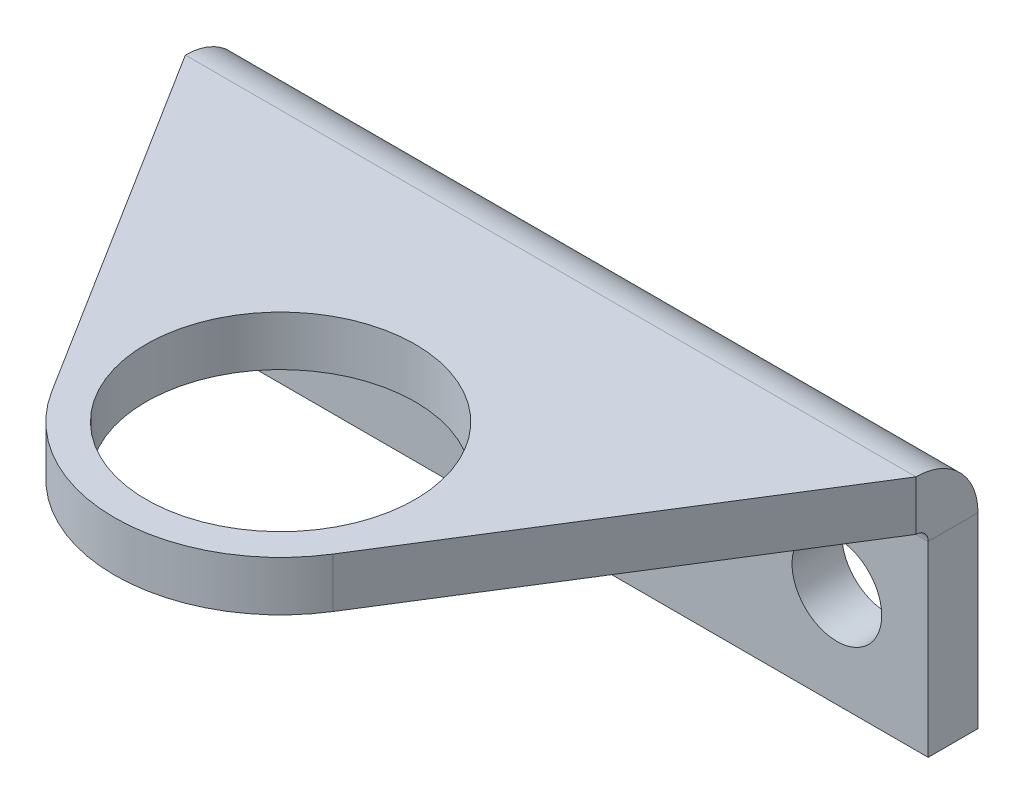
ISO-10303-21;
HEADER;
FILE_DESCRIPTION(('STEP AP214'),'2;1');
FILE_NAME('part.step','',(''),(''),'','','');
FILE_SCHEMA(('AUTOMOTIVE_DESIGN { 1 0 10303 214 1 1 1 1 }'));
ENDSEC;
DATA;
#1=APPLICATION_CONTEXT('core data for automotive mechanical design processes');
#2=APPLICATION_PROTOCOL_DEFINITION('international standard','automotive_design',2000,#1);
#3=PRODUCT_CONTEXT('',#1,'mechanical');
#4=PRODUCT('Part','Part','',(#3));
#5=PRODUCT_RELATED_PRODUCT_CATEGORY('part','',(#4));
#6=PRODUCT_DEFINITION_FORMATION('','',#4);
#7=PRODUCT_DEFINITION_CONTEXT('part definition',#1,'design');
#8=PRODUCT_DEFINITION('design','',#6,#7);
#9=PRODUCT_DEFINITION_SHAPE('','',#8);
#10=(LENGTH_UNIT() NAMED_UNIT(*) SI_UNIT(.MILLI.,.METRE.));
#11=(NAMED_UNIT(*) PLANE_ANGLE_UNIT() SI_UNIT($,.RADIAN.));
#12=(NAMED_UNIT(*) SI_UNIT($,.STERADIAN.) SOLID_ANGLE_UNIT());
#13=UNCERTAINTY_MEASURE_WITH_UNIT(LENGTH_MEASURE(1.E-05),#10,'distance_accuracy_value','');
#14=(GEOMETRIC_REPRESENTATION_CONTEXT(3) GLOBAL_UNCERTAINTY_ASSIGNED_CONTEXT((#13)) GLOBAL_UNIT_ASSIGNED_CONTEXT((#10,
#11,#12)) REPRESENTATION_CONTEXT('',''));
#15=CARTESIAN_POINT('',(0.,0.,0.));
#16=DIRECTION('',(0.,0.,1.));
#17=DIRECTION('',(1.,0.,0.));
#18=AXIS2_PLACEMENT_3D('',#15,#16,#17);
#19=CARTESIAN_POINT('',(0.,0.,-3.));
#20=DIRECTION('',(-1.,0.,0.));
#21=DIRECTION('',(0.,-1.,0.));
#22=AXIS2_PLACEMENT_3D('',#19,#20,#21);
#23=PLANE('',#22);
#24=DIRECTION('',(0.,-1.,0.));
#25=VECTOR('',#24,1.);
#26=CARTESIAN_POINT('',(0.,0.,0.));
#27=LINE('',#26,#25);
#28=CARTESIAN_POINT('',(0.,-0.736599999999996,0.));
#29=VERTEX_POINT('',#28);
#30=CARTESIAN_POINT('',(0.,-12.,0.));
#31=VERTEX_POINT('',#30);
#32=EDGE_CURVE('E85',#29,#31,#27,.T.);
#33=ORIENTED_EDGE('',*,*,#32,.F.);
#34=DIRECTION('',(0.,0.,-1.));
#35=VECTOR('',#34,1.);
#36=CARTESIAN_POINT('',(0.,-0.736599999999997,0.));
#37=LINE('',#36,#35);
#38=CARTESIAN_POINT('',(0.,-0.736599999999991,-3.));
#39=VERTEX_POINT('',#38);
#40=EDGE_CURVE('E106',#29,#39,#37,.T.);
#41=ORIENTED_EDGE('',*,*,#40,.T.);
#42=DIRECTION('',(0.,-1.,0.));
#43=VECTOR('',#42,1.);
#44=CARTESIAN_POINT('',(0.,0.,-3.));
#45=LINE('',#44,#43);
#46=CARTESIAN_POINT('',(0.,-12.,-3.));
#47=VERTEX_POINT('',#46);
#48=EDGE_CURVE('E82',#39,#47,#45,.T.);
#49=ORIENTED_EDGE('',*,*,#48,.T.);
#50=DIRECTION('',(0.,0.,1.));
#51=VECTOR('',#50,1.);
#52=CARTESIAN_POINT('',(0.,-12.,-3.));
#53=LINE('',#52,#51);
#54=EDGE_CURVE('E40',#47,#31,#53,.T.);
#55=ORIENTED_EDGE('',*,*,#54,.T.);
#56=EDGE_LOOP('',(#33,#41,#49,#55));
#57=FACE_BOUND('',#56,.T.);
#58=ADVANCED_FACE('F37',(#57),#23,.T.);
#59=CARTESIAN_POINT('',(0.,0.,-3.));
#60=DIRECTION('',(0.,0.,1.));
#61=DIRECTION('',(1.,0.,0.));
#62=AXIS2_PLACEMENT_3D('',#59,#60,#61);
#63=PLANE('',#62);
#64=CARTESIAN_POINT('',(5.5,-6.,-3.));
#65=DIRECTION('',(0.,0.,1.));
#66=DIRECTION('',(1.,0.,0.));
#67=AXIS2_PLACEMENT_3D('',#64,#65,#66);
#68=CIRCLE('',#67,2.7);
#69=CARTESIAN_POINT('',(8.2,-6.,-3.));
#70=VERTEX_POINT('',#69);
#71=EDGE_CURVE('E88',#70,#70,#68,.T.);
#72=ORIENTED_EDGE('',*,*,#71,.T.);
#73=EDGE_LOOP('',(#72));
#74=FACE_BOUND('',#73,.T.);
#75=CARTESIAN_POINT('',(38.5,-6.,-3.));
#76=DIRECTION('',(0.,0.,1.));
#77=DIRECTION('',(1.,0.,0.));
#78=AXIS2_PLACEMENT_3D('',#75,#76,#77);
#79=CIRCLE('',#78,2.7);
#80=CARTESIAN_POINT('',(41.2,-6.,-3.));
#81=VERTEX_POINT('',#80);
#82=EDGE_CURVE('E98',#81,#81,#79,.T.);
#83=ORIENTED_EDGE('',*,*,#82,.T.);
#84=EDGE_LOOP('',(#83));
#85=FACE_BOUND('',#84,.T.);
#86=DIRECTION('',(-1.,0.,0.));
#87=VECTOR('',#86,1.);
#88=CARTESIAN_POINT('',(0.,-0.736599999999991,-3.));
#89=LINE('',#88,#87);
#90=CARTESIAN_POINT('',(44.,-0.736599999999973,-3.));
#91=VERTEX_POINT('',#90);
#92=EDGE_CURVE('E122',#39,#91,#89,.F.);
#93=ORIENTED_EDGE('',*,*,#92,.T.);
#94=DIRECTION('',(0.,1.,0.));
#95=VECTOR('',#94,1.);
#96=CARTESIAN_POINT('',(44.,0.,-3.));
#97=LINE('',#96,#95);
#98=CARTESIAN_POINT('',(44.,-12.,-3.));
#99=VERTEX_POINT('',#98);
#100=EDGE_CURVE('E91',#99,#91,#97,.T.);
#101=ORIENTED_EDGE('',*,*,#100,.F.);
#102=DIRECTION('',(1.,0.,0.));
#103=VECTOR('',#102,1.);
#104=CARTESIAN_POINT('',(0.,-12.,-3.));
#105=LINE('',#104,#103);
#106=EDGE_CURVE('E75',#47,#99,#105,.T.);
#107=ORIENTED_EDGE('',*,*,#106,.F.);
#108=ORIENTED_EDGE('',*,*,#48,.F.);
#109=EDGE_LOOP('',(#93,#101,#107,#108));
#110=FACE_BOUND('',#109,.T.);
#111=ADVANCED_FACE('F231',(#74,#85,#110),#63,.F.);
#112=CARTESIAN_POINT('',(0.,0.,0.));
#113=DIRECTION('',(0.,0.,1.));
#114=DIRECTION('',(1.,0.,0.));
#115=AXIS2_PLACEMENT_3D('',#112,#113,#114);
#116=PLANE('',#115);
#117=CARTESIAN_POINT('',(38.5,-6.,0.));
#118=DIRECTION('',(0.,0.,1.));
#119=DIRECTION('',(1.,0.,0.));
#120=AXIS2_PLACEMENT_3D('',#117,#118,#119);
#121=CIRCLE('',#120,2.7);
#122=CARTESIAN_POINT('',(41.2,-6.,0.));
#123=VERTEX_POINT('',#122);
#124=EDGE_CURVE('E101',#123,#123,#121,.T.);
#125=ORIENTED_EDGE('',*,*,#124,.F.);
#126=EDGE_LOOP('',(#125));
#127=FACE_BOUND('',#126,.T.);
#128=CARTESIAN_POINT('',(5.5,-6.,0.));
#129=DIRECTION('',(0.,0.,1.));
#130=DIRECTION('',(1.,0.,0.));
#131=AXIS2_PLACEMENT_3D('',#128,#129,#130);
#132=CIRCLE('',#131,2.7);
#133=CARTESIAN_POINT('',(8.2,-6.,0.));
#134=VERTEX_POINT('',#133);
#135=EDGE_CURVE('E95',#134,#134,#132,.T.);
#136=ORIENTED_EDGE('',*,*,#135,.F.);
#137=EDGE_LOOP('',(#136));
#138=FACE_BOUND('',#137,.T.);
#139=DIRECTION('',(0.,1.,0.));
#140=VECTOR('',#139,1.);
#141=CARTESIAN_POINT('',(44.,0.,0.));
#142=LINE('',#141,#140);
#143=CARTESIAN_POINT('',(44.,-12.,0.));
#144=VERTEX_POINT('',#143);
#145=CARTESIAN_POINT('',(44.,-0.736599999999994,0.));
#146=VERTEX_POINT('',#145);
#147=EDGE_CURVE('E77',#144,#146,#142,.T.);
#148=ORIENTED_EDGE('',*,*,#147,.T.);
#149=DIRECTION('',(-1.,0.,0.));
#150=VECTOR('',#149,1.);
#151=CARTESIAN_POINT('',(0.,-0.736599999999997,0.));
#152=LINE('',#151,#150);
#153=EDGE_CURVE('E51',#29,#146,#152,.F.);
#154=ORIENTED_EDGE('',*,*,#153,.F.);
#155=ORIENTED_EDGE('',*,*,#32,.T.);
#156=DIRECTION('',(1.,0.,0.));
#157=VECTOR('',#156,1.);
#158=CARTESIAN_POINT('',(0.,-12.,0.));
#159=LINE('',#158,#157);
#160=EDGE_CURVE('E73',#31,#144,#159,.T.);
#161=ORIENTED_EDGE('',*,*,#160,.T.);
#162=EDGE_LOOP('',(#148,#154,#155,#161));
#163=FACE_BOUND('',#162,.T.);
#164=ADVANCED_FACE('F84',(#127,#138,#163),#116,.T.);
#165=CARTESIAN_POINT('',(44.,0.,-3.));
#166=DIRECTION('',(1.,0.,0.));
#167=DIRECTION('',(0.,0.,-1.));
#168=AXIS2_PLACEMENT_3D('',#165,#166,#167);
#169=PLANE('',#168);
#170=DIRECTION('',(0.,0.,-1.));
#171=VECTOR('',#170,1.);
#172=CARTESIAN_POINT('',(44.,-0.736599999999994,0.));
#173=LINE('',#172,#171);
#174=EDGE_CURVE('E81',#146,#91,#173,.T.);
#175=ORIENTED_EDGE('',*,*,#174,.F.);
#176=ORIENTED_EDGE('',*,*,#147,.F.);
#177=DIRECTION('',(0.,0.,1.));
#178=VECTOR('',#177,1.);
#179=CARTESIAN_POINT('',(44.,-12.,-3.));
#180=LINE('',#179,#178);
#181=EDGE_CURVE('E11',#99,#144,#180,.T.);
#182=ORIENTED_EDGE('',*,*,#181,.F.);
#183=ORIENTED_EDGE('',*,*,#100,.T.);
#184=EDGE_LOOP('',(#175,#176,#182,#183));
#185=FACE_BOUND('',#184,.T.);
#186=ADVANCED_FACE('F78',(#185),#169,.T.);
#187=CARTESIAN_POINT('',(0.,-12.,-3.));
#188=DIRECTION('',(0.,-1.,0.));
#189=DIRECTION('',(0.,0.,-1.));
#190=AXIS2_PLACEMENT_3D('',#187,#188,#189);
#191=PLANE('',#190);
#192=ORIENTED_EDGE('',*,*,#160,.F.);
#193=ORIENTED_EDGE('',*,*,#54,.F.);
#194=ORIENTED_EDGE('',*,*,#106,.T.);
#195=ORIENTED_EDGE('',*,*,#181,.T.);
#196=EDGE_LOOP('',(#192,#193,#194,#195));
#197=FACE_BOUND('',#196,.T.);
#198=ADVANCED_FACE('F70',(#197),#191,.T.);
#199=CARTESIAN_POINT('',(5.5,-6.,-3.));
#200=DIRECTION('',(0.,0.,1.));
#201=DIRECTION('',(1.,0.,0.));
#202=AXIS2_PLACEMENT_3D('',#199,#200,#201);
#203=CYLINDRICAL_SURFACE('',#202,2.7);
#204=ORIENTED_EDGE('',*,*,#71,.F.);
#205=EDGE_LOOP('',(#204));
#206=FACE_BOUND('',#205,.T.);
#207=ORIENTED_EDGE('',*,*,#135,.T.);
#208=EDGE_LOOP('',(#207));
#209=FACE_BOUND('',#208,.T.);
#210=ADVANCED_FACE('F246',(#206,#209),#203,.F.);
#211=CARTESIAN_POINT('',(38.5,-6.,-3.));
#212=DIRECTION('',(0.,0.,1.));
#213=DIRECTION('',(1.,0.,0.));
#214=AXIS2_PLACEMENT_3D('',#211,#212,#213);
#215=CYLINDRICAL_SURFACE('',#214,2.7);
#216=ORIENTED_EDGE('',*,*,#82,.F.);
#217=EDGE_LOOP('',(#216));
#218=FACE_BOUND('',#217,.T.);
#219=ORIENTED_EDGE('',*,*,#124,.T.);
#220=EDGE_LOOP('',(#219));
#221=FACE_BOUND('',#220,.T.);
#222=ADVANCED_FACE('F254',(#218,#221),#215,.F.);
#223=CARTESIAN_POINT('',(44.,-0.736599999999996,0.7366));
#224=DIRECTION('',(1.,0.,0.));
#225=DIRECTION('',(0.,1.,0.));
#226=AXIS2_PLACEMENT_3D('',#223,#224,#225);
#227=PLANE('',#226);
#228=DIRECTION('',(0.,1.,0.));
#229=VECTOR('',#228,1.);
#230=CARTESIAN_POINT('',(44.,0.,0.736599999999997));
#231=LINE('',#230,#229);
#232=CARTESIAN_POINT('',(44.,0.,0.736599999999997));
#233=VERTEX_POINT('',#232);
#234=CARTESIAN_POINT('',(44.,3.00000000000004,0.736599999999987));
#235=VERTEX_POINT('',#234);
#236=EDGE_CURVE('E130',#233,#235,#231,.T.);
#237=ORIENTED_EDGE('',*,*,#236,.F.);
#238=CARTESIAN_POINT('',(44.,-0.736599999999996,0.7366));
#239=DIRECTION('',(-1.,0.,0.));
#240=DIRECTION('',(0.,-1.,0.));
#241=AXIS2_PLACEMENT_3D('',#238,#239,#240);
#242=CIRCLE('',#241,0.736599999999998);
#243=EDGE_CURVE('E116',#146,#233,#242,.F.);
#244=ORIENTED_EDGE('',*,*,#243,.F.);
#245=ORIENTED_EDGE('',*,*,#174,.T.);
#246=CARTESIAN_POINT('',(44.,-0.736599999999996,0.7366));
#247=DIRECTION('',(-1.,0.,0.));
#248=DIRECTION('',(0.,-1.,0.));
#249=AXIS2_PLACEMENT_3D('',#246,#247,#248);
#250=CIRCLE('',#249,3.7366);
#251=EDGE_CURVE('E109',#91,#235,#250,.F.);
#252=ORIENTED_EDGE('',*,*,#251,.T.);
#253=EDGE_LOOP('',(#237,#244,#245,#252));
#254=FACE_BOUND('',#253,.T.);
#255=ADVANCED_FACE('F195',(#254),#227,.T.);
#256=CARTESIAN_POINT('',(0.,-0.736599999999999,0.7366));
#257=DIRECTION('',(1.,0.,0.));
#258=DIRECTION('',(0.,1.,0.));
#259=AXIS2_PLACEMENT_3D('',#256,#257,#258);
#260=PLANE('',#259);
#261=CARTESIAN_POINT('',(0.,-0.736599999999999,0.7366));
#262=DIRECTION('',(-1.,0.,0.));
#263=DIRECTION('',(0.,-1.,0.));
#264=AXIS2_PLACEMENT_3D('',#261,#262,#263);
#265=CIRCLE('',#264,0.736599999999998);
#266=CARTESIAN_POINT('',(0.,0.,0.736599999999997));
#267=VERTEX_POINT('',#266);
#268=EDGE_CURVE('E111',#267,#29,#265,.T.);
#269=ORIENTED_EDGE('',*,*,#268,.F.);
#270=DIRECTION('',(0.,1.,0.));
#271=VECTOR('',#270,1.);
#272=CARTESIAN_POINT('',(0.,0.,0.736599999999997));
#273=LINE('',#272,#271);
#274=CARTESIAN_POINT('',(0.,3.00000000000004,0.736599999999987));
#275=VERTEX_POINT('',#274);
#276=EDGE_CURVE('E129',#267,#275,#273,.T.);
#277=ORIENTED_EDGE('',*,*,#276,.T.);
#278=CARTESIAN_POINT('',(0.,-0.736599999999999,0.7366));
#279=DIRECTION('',(-1.,0.,0.));
#280=DIRECTION('',(0.,-1.,0.));
#281=AXIS2_PLACEMENT_3D('',#278,#279,#280);
#282=CIRCLE('',#281,3.7366);
#283=EDGE_CURVE('E119',#275,#39,#282,.T.);
#284=ORIENTED_EDGE('',*,*,#283,.T.);
#285=ORIENTED_EDGE('',*,*,#40,.F.);
#286=EDGE_LOOP('',(#269,#277,#284,#285));
#287=FACE_BOUND('',#286,.T.);
#288=ADVANCED_FACE('F224',(#287),#260,.F.);
#289=CARTESIAN_POINT('',(0.,-0.736599999999999,0.7366));
#290=DIRECTION('',(-1.,0.,0.));
#291=DIRECTION('',(0.,1.,0.));
#292=AXIS2_PLACEMENT_3D('',#289,#290,#291);
#293=CYLINDRICAL_SURFACE('',#292,3.7366);
#294=ORIENTED_EDGE('',*,*,#92,.F.);
#295=ORIENTED_EDGE('',*,*,#283,.F.);
#296=DIRECTION('',(1.,0.,0.));
#297=VECTOR('',#296,1.);
#298=CARTESIAN_POINT('',(0.,3.,0.736599999999987));
#299=LINE('',#298,#297);
#300=EDGE_CURVE('E114',#275,#235,#299,.T.);
#301=ORIENTED_EDGE('',*,*,#300,.T.);
#302=ORIENTED_EDGE('',*,*,#251,.F.);
#303=EDGE_LOOP('',(#294,#295,#301,#302));
#304=FACE_BOUND('',#303,.T.);
#305=ADVANCED_FACE('F229',(#304),#293,.T.);
#306=CARTESIAN_POINT('',(0.,-0.736599999999999,0.7366));
#307=DIRECTION('',(-1.,0.,0.));
#308=DIRECTION('',(0.,1.,0.));
#309=AXIS2_PLACEMENT_3D('',#306,#307,#308);
#310=CYLINDRICAL_SURFACE('',#309,0.736599999999998);
#311=ORIENTED_EDGE('',*,*,#153,.T.);
#312=ORIENTED_EDGE('',*,*,#243,.T.);
#313=DIRECTION('',(-1.,0.,0.));
#314=VECTOR('',#313,1.);
#315=CARTESIAN_POINT('',(44.,0.,0.736599999999997));
#316=LINE('',#315,#314);
#317=EDGE_CURVE('E133',#233,#267,#316,.T.);
#318=ORIENTED_EDGE('',*,*,#317,.T.);
#319=ORIENTED_EDGE('',*,*,#268,.T.);
#320=EDGE_LOOP('',(#311,#312,#318,#319));
#321=FACE_BOUND('',#320,.T.);
#322=ADVANCED_FACE('F198',(#321),#310,.F.);
#323=CARTESIAN_POINT('',(0.,3.,0.));
#324=DIRECTION('',(0.,-1.,0.));
#325=DIRECTION('',(0.,0.,-1.));
#326=AXIS2_PLACEMENT_3D('',#323,#324,#325);
#327=PLANE('',#326);
#328=CARTESIAN_POINT('',(22.,3.00000000000006,17.));
#329=DIRECTION('',(0.,-1.,0.));
#330=DIRECTION('',(0.,0.,-1.));
#331=AXIS2_PLACEMENT_3D('',#328,#329,#330);
#332=CIRCLE('',#331,8.09999999999999);
#333=CARTESIAN_POINT('',(22.,3.00000000000003,8.89999999999995));
#334=VERTEX_POINT('',#333);
#335=EDGE_CURVE('E162',#334,#334,#332,.T.);
#336=ORIENTED_EDGE('',*,*,#335,.T.);
#337=EDGE_LOOP('',(#336));
#338=FACE_BOUND('',#337,.T.);
#339=CARTESIAN_POINT('',(22.,3.00000000000006,17.));
#340=DIRECTION('',(0.,-1.,0.));
#341=DIRECTION('',(0.,0.,-1.));
#342=AXIS2_PLACEMENT_3D('',#339,#340,#341);
#343=CIRCLE('',#342,9.99999999999998);
#344=CARTESIAN_POINT('',(13.5275988346628,3.00000000000004,22.3121011373648));
#345=VERTEX_POINT('',#344);
#346=CARTESIAN_POINT('',(30.4724011653372,3.00000000000002,22.3121011373648));
#347=VERTEX_POINT('',#346);
#348=EDGE_CURVE('E141',#345,#347,#343,.F.);
#349=ORIENTED_EDGE('',*,*,#348,.T.);
#350=DIRECTION('',(0.531210113736482,0.,-0.847240116533722));
#351=VECTOR('',#350,1.);
#352=CARTESIAN_POINT('',(31.9154119140686,3.00000000000007,20.0106076919273));
#353=LINE('',#352,#351);
#354=EDGE_CURVE('E134',#347,#235,#353,.T.);
#355=ORIENTED_EDGE('',*,*,#354,.T.);
#356=ORIENTED_EDGE('',*,*,#300,.F.);
#357=DIRECTION('',(0.531210113736482,0.,0.847240116533722));
#358=VECTOR('',#357,1.);
#359=CARTESIAN_POINT('',(-0.331516051249366,3.,0.207856870623792));
#360=LINE('',#359,#358);
#361=EDGE_CURVE('E144',#275,#345,#360,.T.);
#362=ORIENTED_EDGE('',*,*,#361,.T.);
#363=EDGE_LOOP('',(#349,#355,#356,#362));
#364=FACE_BOUND('',#363,.T.);
#365=ADVANCED_FACE('F176',(#338,#364),#327,.F.);
#366=CARTESIAN_POINT('',(0.,0.,0.));
#367=DIRECTION('',(0.,-1.,0.));
#368=DIRECTION('',(0.,0.,-1.));
#369=AXIS2_PLACEMENT_3D('',#366,#367,#368);
#370=PLANE('',#369);
#371=CARTESIAN_POINT('',(22.,0.,17.));
#372=DIRECTION('',(0.,-1.,0.));
#373=DIRECTION('',(0.,0.,-1.));
#374=AXIS2_PLACEMENT_3D('',#371,#372,#373);
#375=CIRCLE('',#374,8.09999999999999);
#376=CARTESIAN_POINT('',(22.,0.,8.89999999999996));
#377=VERTEX_POINT('',#376);
#378=EDGE_CURVE('E165',#377,#377,#375,.T.);
#379=ORIENTED_EDGE('',*,*,#378,.F.);
#380=EDGE_LOOP('',(#379));
#381=FACE_BOUND('',#380,.T.);
#382=DIRECTION('',(0.531210113736482,0.,-0.847240116533722));
#383=VECTOR('',#382,1.);
#384=CARTESIAN_POINT('',(44.,0.,0.736599999999997));
#385=LINE('',#384,#383);
#386=CARTESIAN_POINT('',(30.4724011653372,0.,22.3121011373648));
#387=VERTEX_POINT('',#386);
#388=EDGE_CURVE('E151',#387,#233,#385,.T.);
#389=ORIENTED_EDGE('',*,*,#388,.F.);
#390=CARTESIAN_POINT('',(22.,0.,17.));
#391=DIRECTION('',(0.,1.,0.));
#392=DIRECTION('',(0.,0.,1.));
#393=AXIS2_PLACEMENT_3D('',#390,#391,#392);
#394=CIRCLE('',#393,9.99999999999998);
#395=CARTESIAN_POINT('',(13.5275988346628,0.,22.3121011373648));
#396=VERTEX_POINT('',#395);
#397=EDGE_CURVE('E156',#396,#387,#394,.T.);
#398=ORIENTED_EDGE('',*,*,#397,.F.);
#399=DIRECTION('',(0.531210113736482,0.,0.847240116533721));
#400=VECTOR('',#399,1.);
#401=CARTESIAN_POINT('',(0.,0.,0.736599999999997));
#402=LINE('',#401,#400);
#403=EDGE_CURVE('E159',#267,#396,#402,.T.);
#404=ORIENTED_EDGE('',*,*,#403,.F.);
#405=ORIENTED_EDGE('',*,*,#317,.F.);
#406=EDGE_LOOP('',(#389,#398,#404,#405));
#407=FACE_BOUND('',#406,.T.);
#408=ADVANCED_FACE('F172',(#381,#407),#370,.T.);
#409=CARTESIAN_POINT('',(44.,10.,0.736599999999963));
#410=DIRECTION('',(-0.847240116533722,0.,-0.531210113736482));
#411=DIRECTION('',(-0.531210113736482,0.,0.847240116533722));
#412=AXIS2_PLACEMENT_3D('',#409,#410,#411);
#413=PLANE('',#412);
#414=DIRECTION('',(0.,-1.,0.));
#415=VECTOR('',#414,1.);
#416=CARTESIAN_POINT('',(30.4724011653372,10.0000000000001,22.3121011373647));
#417=LINE('',#416,#415);
#418=EDGE_CURVE('E147',#347,#387,#417,.T.);
#419=ORIENTED_EDGE('',*,*,#418,.T.);
#420=ORIENTED_EDGE('',*,*,#388,.T.);
#421=ORIENTED_EDGE('',*,*,#236,.T.);
#422=ORIENTED_EDGE('',*,*,#354,.F.);
#423=EDGE_LOOP('',(#419,#420,#421,#422));
#424=FACE_BOUND('',#423,.T.);
#425=ADVANCED_FACE('F175',(#424),#413,.F.);
#426=CARTESIAN_POINT('',(22.,10.0000000000001,16.9999999999999));
#427=DIRECTION('',(0.,-1.,0.));
#428=DIRECTION('',(0.,0.,-1.));
#429=AXIS2_PLACEMENT_3D('',#426,#427,#428);
#430=CYLINDRICAL_SURFACE('',#429,9.99999999999998);
#431=DIRECTION('',(0.,-1.,0.));
#432=VECTOR('',#431,1.);
#433=CARTESIAN_POINT('',(13.5275988346628,10.0000000000001,22.3121011373647));
#434=LINE('',#433,#432);
#435=EDGE_CURVE('E148',#345,#396,#434,.T.);
#436=ORIENTED_EDGE('',*,*,#435,.T.);
#437=ORIENTED_EDGE('',*,*,#397,.T.);
#438=ORIENTED_EDGE('',*,*,#418,.F.);
#439=ORIENTED_EDGE('',*,*,#348,.F.);
#440=EDGE_LOOP('',(#436,#437,#438,#439));
#441=FACE_BOUND('',#440,.T.);
#442=ADVANCED_FACE('F218',(#441),#430,.T.);
#443=CARTESIAN_POINT('',(0.,10.,0.736599999999963));
#444=DIRECTION('',(0.847240116533722,0.,-0.531210113736482));
#445=DIRECTION('',(-0.531210113736482,0.,-0.847240116533722));
#446=AXIS2_PLACEMENT_3D('',#443,#444,#445);
#447=PLANE('',#446);
#448=ORIENTED_EDGE('',*,*,#276,.F.);
#449=ORIENTED_EDGE('',*,*,#403,.T.);
#450=ORIENTED_EDGE('',*,*,#435,.F.);
#451=ORIENTED_EDGE('',*,*,#361,.F.);
#452=EDGE_LOOP('',(#448,#449,#450,#451));
#453=FACE_BOUND('',#452,.T.);
#454=ADVANCED_FACE('F220',(#453),#447,.F.);
#455=CARTESIAN_POINT('',(22.,10.0000000000001,16.9999999999999));
#456=DIRECTION('',(0.,-1.,0.));
#457=DIRECTION('',(0.,0.,-1.));
#458=AXIS2_PLACEMENT_3D('',#455,#456,#457);
#459=CYLINDRICAL_SURFACE('',#458,8.09999999999999);
#460=ORIENTED_EDGE('',*,*,#378,.T.);
#461=EDGE_LOOP('',(#460));
#462=FACE_BOUND('',#461,.T.);
#463=ORIENTED_EDGE('',*,*,#335,.F.);
#464=EDGE_LOOP('',(#463));
#465=FACE_BOUND('',#464,.T.);
#466=ADVANCED_FACE('F169',(#462,#465),#459,.F.);
#467=CLOSED_SHELL('',(#58,#111,#164,#186,#198,#210,#222,#255,#288,#305,#322,#365,#408,#425,#442,
#454,#466));
#468=MANIFOLD_SOLID_BREP('B2',#467);
#469=ADVANCED_BREP_SHAPE_REPRESENTATION('',(#18,#468),#14);
#470=SHAPE_DEFINITION_REPRESENTATION(#9,#469);
ENDSEC;
END-ISO-10303-21;
